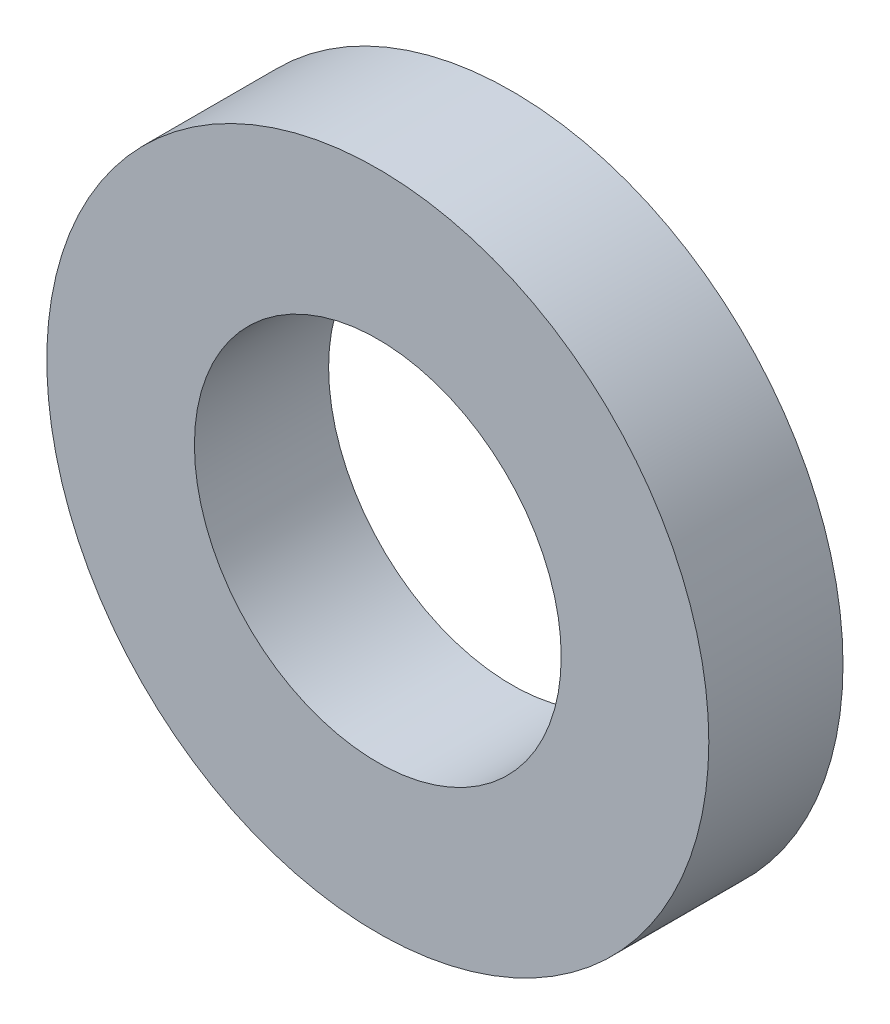
ISO-10303-21;
HEADER;
FILE_DESCRIPTION(('STEP AP214'),'2;1');
FILE_NAME('part.step','',(''),(''),'','','');
FILE_SCHEMA(('AUTOMOTIVE_DESIGN { 1 0 10303 214 1 1 1 1 }'));
ENDSEC;
DATA;
#1=APPLICATION_CONTEXT('core data for automotive mechanical design processes');
#2=APPLICATION_PROTOCOL_DEFINITION('international standard','automotive_design',2000,#1);
#3=PRODUCT_CONTEXT('',#1,'mechanical');
#4=PRODUCT('Part','Part','',(#3));
#5=PRODUCT_RELATED_PRODUCT_CATEGORY('part','',(#4));
#6=PRODUCT_DEFINITION_FORMATION('','',#4);
#7=PRODUCT_DEFINITION_CONTEXT('part definition',#1,'design');
#8=PRODUCT_DEFINITION('design','',#6,#7);
#9=PRODUCT_DEFINITION_SHAPE('','',#8);
#10=(LENGTH_UNIT() NAMED_UNIT(*) SI_UNIT(.MILLI.,.METRE.));
#11=(NAMED_UNIT(*) PLANE_ANGLE_UNIT() SI_UNIT($,.RADIAN.));
#12=(NAMED_UNIT(*) SI_UNIT($,.STERADIAN.) SOLID_ANGLE_UNIT());
#13=UNCERTAINTY_MEASURE_WITH_UNIT(LENGTH_MEASURE(1.E-05),#10,'distance_accuracy_value','');
#14=(GEOMETRIC_REPRESENTATION_CONTEXT(3) GLOBAL_UNCERTAINTY_ASSIGNED_CONTEXT((#13)) GLOBAL_UNIT_ASSIGNED_CONTEXT((#10,
#11,#12)) REPRESENTATION_CONTEXT('',''));
#15=CARTESIAN_POINT('',(0.,0.,0.));
#16=DIRECTION('',(0.,0.,1.));
#17=DIRECTION('',(1.,0.,0.));
#18=AXIS2_PLACEMENT_3D('',#15,#16,#17);
#19=CARTESIAN_POINT('',(0.,0.,3.));
#20=DIRECTION('',(0.,0.,1.));
#21=DIRECTION('',(1.,0.,0.));
#22=AXIS2_PLACEMENT_3D('',#19,#20,#21);
#23=PLANE('',#22);
#24=CARTESIAN_POINT('',(0.,0.,3.));
#25=DIRECTION('',(0.,0.,1.));
#26=DIRECTION('',(1.,0.,0.));
#27=AXIS2_PLACEMENT_3D('',#24,#25,#26);
#28=CIRCLE('',#27,7.4);
#29=CARTESIAN_POINT('',(7.4,0.,3.));
#30=VERTEX_POINT('',#29);
#31=EDGE_CURVE('E10',#30,#30,#28,.T.);
#32=ORIENTED_EDGE('',*,*,#31,.T.);
#33=EDGE_LOOP('',(#32));
#34=FACE_BOUND('',#33,.T.);
#35=CARTESIAN_POINT('',(0.,0.,3.));
#36=DIRECTION('',(0.,0.,1.));
#37=DIRECTION('',(1.,0.,0.));
#38=AXIS2_PLACEMENT_3D('',#35,#36,#37);
#39=CIRCLE('',#38,4.1);
#40=CARTESIAN_POINT('',(4.1,0.,3.));
#41=VERTEX_POINT('',#40);
#42=EDGE_CURVE('E50',#41,#41,#39,.T.);
#43=ORIENTED_EDGE('',*,*,#42,.F.);
#44=EDGE_LOOP('',(#43));
#45=FACE_BOUND('',#44,.T.);
#46=ADVANCED_FACE('F37',(#34,#45),#23,.T.);
#47=CARTESIAN_POINT('',(0.,0.,0.));
#48=DIRECTION('',(0.,0.,1.));
#49=DIRECTION('',(1.,0.,0.));
#50=AXIS2_PLACEMENT_3D('',#47,#48,#49);
#51=PLANE('',#50);
#52=CARTESIAN_POINT('',(0.,0.,0.));
#53=DIRECTION('',(0.,0.,1.));
#54=DIRECTION('',(1.,0.,0.));
#55=AXIS2_PLACEMENT_3D('',#52,#53,#54);
#56=CIRCLE('',#55,7.4);
#57=CARTESIAN_POINT('',(7.4,0.,0.));
#58=VERTEX_POINT('',#57);
#59=EDGE_CURVE('E41',#58,#58,#56,.T.);
#60=ORIENTED_EDGE('',*,*,#59,.F.);
#61=EDGE_LOOP('',(#60));
#62=FACE_BOUND('',#61,.T.);
#63=CARTESIAN_POINT('',(0.,0.,0.));
#64=DIRECTION('',(0.,0.,1.));
#65=DIRECTION('',(1.,0.,0.));
#66=AXIS2_PLACEMENT_3D('',#63,#64,#65);
#67=CIRCLE('',#66,4.1);
#68=CARTESIAN_POINT('',(4.1,0.,0.));
#69=VERTEX_POINT('',#68);
#70=EDGE_CURVE('E52',#69,#69,#67,.T.);
#71=ORIENTED_EDGE('',*,*,#70,.T.);
#72=EDGE_LOOP('',(#71));
#73=FACE_BOUND('',#72,.T.);
#74=ADVANCED_FACE('F64',(#62,#73),#51,.F.);
#75=CARTESIAN_POINT('',(0.,0.,3.));
#76=DIRECTION('',(0.,0.,-1.));
#77=DIRECTION('',(-1.,0.,0.));
#78=AXIS2_PLACEMENT_3D('',#75,#76,#77);
#79=CYLINDRICAL_SURFACE('',#78,7.4);
#80=ORIENTED_EDGE('',*,*,#31,.F.);
#81=EDGE_LOOP('',(#80));
#82=FACE_BOUND('',#81,.T.);
#83=ORIENTED_EDGE('',*,*,#59,.T.);
#84=EDGE_LOOP('',(#83));
#85=FACE_BOUND('',#84,.T.);
#86=ADVANCED_FACE('F39',(#82,#85),#79,.T.);
#87=CARTESIAN_POINT('',(0.,0.,3.));
#88=DIRECTION('',(0.,0.,-1.));
#89=DIRECTION('',(-1.,0.,0.));
#90=AXIS2_PLACEMENT_3D('',#87,#88,#89);
#91=CYLINDRICAL_SURFACE('',#90,4.1);
#92=ORIENTED_EDGE('',*,*,#42,.T.);
#93=EDGE_LOOP('',(#92));
#94=FACE_BOUND('',#93,.T.);
#95=ORIENTED_EDGE('',*,*,#70,.F.);
#96=EDGE_LOOP('',(#95));
#97=FACE_BOUND('',#96,.T.);
#98=ADVANCED_FACE('F60',(#94,#97),#91,.F.);
#99=CLOSED_SHELL('',(#46,#74,#86,#98));
#100=MANIFOLD_SOLID_BREP('B2',#99);
#101=ADVANCED_BREP_SHAPE_REPRESENTATION('',(#18,#100),#14);
#102=SHAPE_DEFINITION_REPRESENTATION(#9,#101);
ENDSEC;
END-ISO-10303-21;
